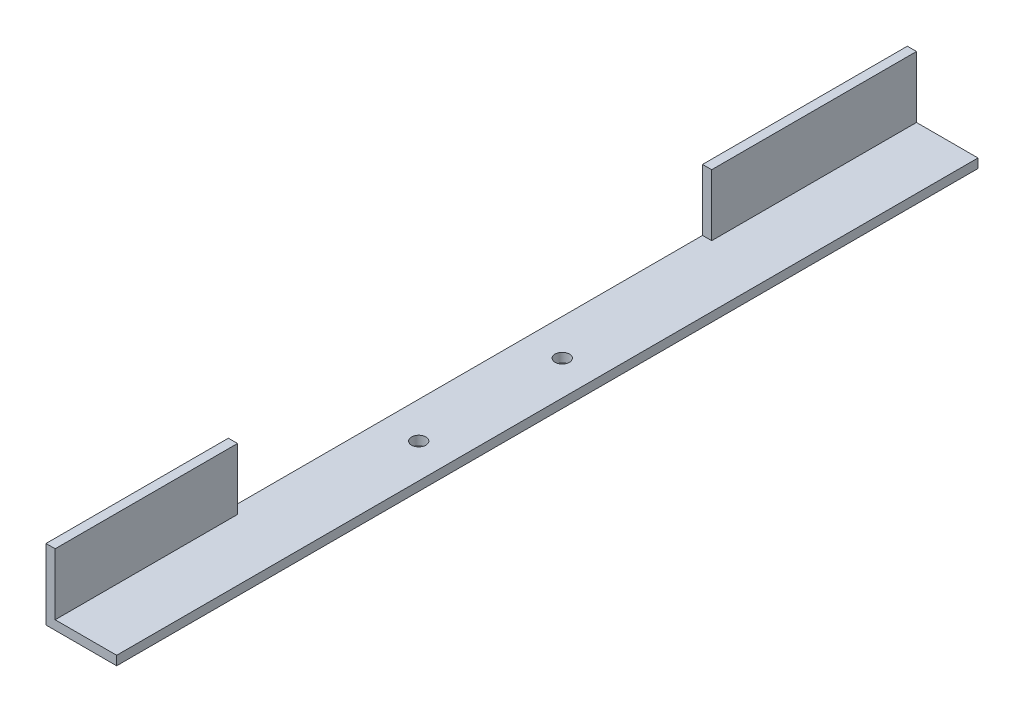
ISO-10303-21;
HEADER;
FILE_DESCRIPTION(('STEP AP214'),'2;1');
FILE_NAME('part.step','',(''),(''),'','','');
FILE_SCHEMA(('AUTOMOTIVE_DESIGN { 1 0 10303 214 1 1 1 1 }'));
ENDSEC;
DATA;
#1=APPLICATION_CONTEXT('core data for automotive mechanical design processes');
#2=APPLICATION_PROTOCOL_DEFINITION('international standard','automotive_design',2000,#1);
#3=PRODUCT_CONTEXT('',#1,'mechanical');
#4=PRODUCT('Part','Part','',(#3));
#5=PRODUCT_RELATED_PRODUCT_CATEGORY('part','',(#4));
#6=PRODUCT_DEFINITION_FORMATION('','',#4);
#7=PRODUCT_DEFINITION_CONTEXT('part definition',#1,'design');
#8=PRODUCT_DEFINITION('design','',#6,#7);
#9=PRODUCT_DEFINITION_SHAPE('','',#8);
#10=(LENGTH_UNIT() NAMED_UNIT(*) SI_UNIT(.MILLI.,.METRE.));
#11=(NAMED_UNIT(*) PLANE_ANGLE_UNIT() SI_UNIT($,.RADIAN.));
#12=(NAMED_UNIT(*) SI_UNIT($,.STERADIAN.) SOLID_ANGLE_UNIT());
#13=UNCERTAINTY_MEASURE_WITH_UNIT(LENGTH_MEASURE(1.E-05),#10,'distance_accuracy_value','');
#14=(GEOMETRIC_REPRESENTATION_CONTEXT(3) GLOBAL_UNCERTAINTY_ASSIGNED_CONTEXT((#13)) GLOBAL_UNIT_ASSIGNED_CONTEXT((#10,
#11,#12)) REPRESENTATION_CONTEXT('',''));
#15=CARTESIAN_POINT('',(0.,0.,0.));
#16=DIRECTION('',(0.,0.,1.));
#17=DIRECTION('',(1.,0.,0.));
#18=AXIS2_PLACEMENT_3D('',#15,#16,#17);
#19=CARTESIAN_POINT('',(3.24,25.,304.8));
#20=DIRECTION('',(-1.,0.,0.));
#21=DIRECTION('',(0.,-1.,0.));
#22=AXIS2_PLACEMENT_3D('',#19,#20,#21);
#23=PLANE('',#22);
#24=DIRECTION('',(0.,0.,-1.));
#25=VECTOR('',#24,1.);
#26=CARTESIAN_POINT('',(3.24,3.24,304.8));
#27=LINE('',#26,#25);
#28=CARTESIAN_POINT('',(3.24,3.24,304.8));
#29=VERTEX_POINT('',#28);
#30=CARTESIAN_POINT('',(3.24,3.24,240.273476344111));
#31=VERTEX_POINT('',#30);
#32=EDGE_CURVE('E154',#29,#31,#27,.T.);
#33=ORIENTED_EDGE('',*,*,#32,.T.);
#34=DIRECTION('',(0.,-1.,0.));
#35=VECTOR('',#34,1.);
#36=CARTESIAN_POINT('',(3.24,3.24,240.273476344111));
#37=LINE('',#36,#35);
#38=CARTESIAN_POINT('',(3.24,25.,240.273476344111));
#39=VERTEX_POINT('',#38);
#40=EDGE_CURVE('E120',#39,#31,#37,.T.);
#41=ORIENTED_EDGE('',*,*,#40,.F.);
#42=DIRECTION('',(0.,0.,-1.));
#43=VECTOR('',#42,1.);
#44=CARTESIAN_POINT('',(3.24,25.,304.8));
#45=LINE('',#44,#43);
#46=CARTESIAN_POINT('',(3.24,25.,304.8));
#47=VERTEX_POINT('',#46);
#48=EDGE_CURVE('E117',#47,#39,#45,.T.);
#49=ORIENTED_EDGE('',*,*,#48,.F.);
#50=DIRECTION('',(0.,1.,0.));
#51=VECTOR('',#50,1.);
#52=CARTESIAN_POINT('',(3.24,25.,304.8));
#53=LINE('',#52,#51);
#54=EDGE_CURVE('E103',#29,#47,#53,.T.);
#55=ORIENTED_EDGE('',*,*,#54,.F.);
#56=EDGE_LOOP('',(#33,#41,#49,#55));
#57=FACE_BOUND('',#56,.T.);
#58=ADVANCED_FACE('F35',(#57),#23,.F.);
#59=CARTESIAN_POINT('',(0.,25.,304.8));
#60=DIRECTION('',(0.,-1.,0.));
#61=DIRECTION('',(0.,0.,-1.));
#62=AXIS2_PLACEMENT_3D('',#59,#60,#61);
#63=PLANE('',#62);
#64=ORIENTED_EDGE('',*,*,#48,.T.);
#65=DIRECTION('',(1.,0.,0.));
#66=VECTOR('',#65,1.);
#67=CARTESIAN_POINT('',(-301.56,24.9999999999999,240.273476344111));
#68=LINE('',#67,#66);
#69=CARTESIAN_POINT('',(-1.11022302462516E-13,25.,240.273476344111));
#70=VERTEX_POINT('',#69);
#71=EDGE_CURVE('E138',#70,#39,#68,.T.);
#72=ORIENTED_EDGE('',*,*,#71,.F.);
#73=DIRECTION('',(0.,0.,-1.));
#74=VECTOR('',#73,1.);
#75=CARTESIAN_POINT('',(0.,25.,304.8));
#76=LINE('',#75,#74);
#77=CARTESIAN_POINT('',(0.,25.,304.8));
#78=VERTEX_POINT('',#77);
#79=EDGE_CURVE('E128',#78,#70,#76,.T.);
#80=ORIENTED_EDGE('',*,*,#79,.F.);
#81=DIRECTION('',(-1.,0.,0.));
#82=VECTOR('',#81,1.);
#83=CARTESIAN_POINT('',(0.,25.,304.8));
#84=LINE('',#83,#82);
#85=EDGE_CURVE('E107',#47,#78,#84,.T.);
#86=ORIENTED_EDGE('',*,*,#85,.F.);
#87=EDGE_LOOP('',(#64,#72,#80,#86));
#88=FACE_BOUND('',#87,.T.);
#89=ADVANCED_FACE('F126',(#88),#63,.F.);
#90=CARTESIAN_POINT('',(0.,0.,304.8));
#91=DIRECTION('',(0.,1.,0.));
#92=DIRECTION('',(0.,0.,1.));
#93=AXIS2_PLACEMENT_3D('',#90,#91,#92);
#94=PLANE('',#93);
#95=CARTESIAN_POINT('',(12.8034461610165,0.,185.715129807359));
#96=DIRECTION('',(0.,1.,0.));
#97=DIRECTION('',(0.,0.,1.));
#98=AXIS2_PLACEMENT_3D('',#95,#96,#97);
#99=CIRCLE('',#98,2.54000000000001);
#100=CARTESIAN_POINT('',(12.8034461610165,-1.11022302462516E-13,188.255129807359));
#101=VERTEX_POINT('',#100);
#102=EDGE_CURVE('E221',#101,#101,#99,.T.);
#103=ORIENTED_EDGE('',*,*,#102,.T.);
#104=EDGE_LOOP('',(#103));
#105=FACE_BOUND('',#104,.T.);
#106=CARTESIAN_POINT('',(12.7974952313434,0.,134.915130155918));
#107=DIRECTION('',(0.,1.,0.));
#108=DIRECTION('',(0.,0.,1.));
#109=AXIS2_PLACEMENT_3D('',#106,#107,#108);
#110=CIRCLE('',#109,2.54000000000001);
#111=CARTESIAN_POINT('',(12.7974952313434,-1.11022302462516E-13,137.455130155918));
#112=VERTEX_POINT('',#111);
#113=EDGE_CURVE('E214',#112,#112,#110,.T.);
#114=ORIENTED_EDGE('',*,*,#113,.T.);
#115=EDGE_LOOP('',(#114));
#116=FACE_BOUND('',#115,.T.);
#117=DIRECTION('',(1.,0.,0.));
#118=VECTOR('',#117,1.);
#119=CARTESIAN_POINT('',(0.,0.,0.));
#120=LINE('',#119,#118);
#121=CARTESIAN_POINT('',(0.,0.,0.));
#122=VERTEX_POINT('',#121);
#123=CARTESIAN_POINT('',(25.,0.,0.));
#124=VERTEX_POINT('',#123);
#125=EDGE_CURVE('E134',#122,#124,#120,.T.);
#126=ORIENTED_EDGE('',*,*,#125,.T.);
#127=DIRECTION('',(0.,0.,-1.));
#128=VECTOR('',#127,1.);
#129=CARTESIAN_POINT('',(25.,0.,304.8));
#130=LINE('',#129,#128);
#131=CARTESIAN_POINT('',(25.,0.,304.8));
#132=VERTEX_POINT('',#131);
#133=EDGE_CURVE('E159',#132,#124,#130,.T.);
#134=ORIENTED_EDGE('',*,*,#133,.F.);
#135=DIRECTION('',(1.,0.,0.));
#136=VECTOR('',#135,1.);
#137=CARTESIAN_POINT('',(0.,0.,304.8));
#138=LINE('',#137,#136);
#139=CARTESIAN_POINT('',(0.,0.,304.8));
#140=VERTEX_POINT('',#139);
#141=EDGE_CURVE('E150',#140,#132,#138,.T.);
#142=ORIENTED_EDGE('',*,*,#141,.F.);
#143=DIRECTION('',(0.,0.,-1.));
#144=VECTOR('',#143,1.);
#145=CARTESIAN_POINT('',(0.,0.,304.8));
#146=LINE('',#145,#144);
#147=EDGE_CURVE('E130',#140,#122,#146,.T.);
#148=ORIENTED_EDGE('',*,*,#147,.T.);
#149=EDGE_LOOP('',(#126,#134,#142,#148));
#150=FACE_BOUND('',#149,.T.);
#151=ADVANCED_FACE('F37',(#105,#116,#150),#94,.F.);
#152=CARTESIAN_POINT('',(25.,0.,304.8));
#153=DIRECTION('',(-1.,0.,0.));
#154=DIRECTION('',(0.,0.,1.));
#155=AXIS2_PLACEMENT_3D('',#152,#153,#154);
#156=PLANE('',#155);
#157=DIRECTION('',(0.,1.,0.));
#158=VECTOR('',#157,1.);
#159=CARTESIAN_POINT('',(25.,0.,0.));
#160=LINE('',#159,#158);
#161=CARTESIAN_POINT('',(25.,3.24,0.));
#162=VERTEX_POINT('',#161);
#163=EDGE_CURVE('E137',#124,#162,#160,.T.);
#164=ORIENTED_EDGE('',*,*,#163,.T.);
#165=DIRECTION('',(0.,0.,-1.));
#166=VECTOR('',#165,1.);
#167=CARTESIAN_POINT('',(25.,3.24,304.8));
#168=LINE('',#167,#166);
#169=CARTESIAN_POINT('',(25.,3.24,304.8));
#170=VERTEX_POINT('',#169);
#171=EDGE_CURVE('E156',#170,#162,#168,.T.);
#172=ORIENTED_EDGE('',*,*,#171,.F.);
#173=DIRECTION('',(0.,1.,0.));
#174=VECTOR('',#173,1.);
#175=CARTESIAN_POINT('',(25.,0.,304.8));
#176=LINE('',#175,#174);
#177=EDGE_CURVE('E94',#132,#170,#176,.T.);
#178=ORIENTED_EDGE('',*,*,#177,.F.);
#179=ORIENTED_EDGE('',*,*,#133,.T.);
#180=EDGE_LOOP('',(#164,#172,#178,#179));
#181=FACE_BOUND('',#180,.T.);
#182=ADVANCED_FACE('F201',(#181),#156,.F.);
#183=CARTESIAN_POINT('',(3.24,3.24,304.8));
#184=DIRECTION('',(0.,-1.,0.));
#185=DIRECTION('',(0.,0.,-1.));
#186=AXIS2_PLACEMENT_3D('',#183,#184,#185);
#187=PLANE('',#186);
#188=CARTESIAN_POINT('',(12.8034461610165,3.24,185.715129807359));
#189=DIRECTION('',(0.,1.,0.));
#190=DIRECTION('',(0.,0.,1.));
#191=AXIS2_PLACEMENT_3D('',#188,#189,#190);
#192=CIRCLE('',#191,2.54000000000001);
#193=CARTESIAN_POINT('',(12.8034461610165,3.24000000000002,188.255129807359));
#194=VERTEX_POINT('',#193);
#195=EDGE_CURVE('E224',#194,#194,#192,.T.);
#196=ORIENTED_EDGE('',*,*,#195,.F.);
#197=EDGE_LOOP('',(#196));
#198=FACE_BOUND('',#197,.T.);
#199=CARTESIAN_POINT('',(12.7974952313434,3.24,134.915130155918));
#200=DIRECTION('',(0.,1.,0.));
#201=DIRECTION('',(0.,0.,1.));
#202=AXIS2_PLACEMENT_3D('',#199,#200,#201);
#203=CIRCLE('',#202,2.54000000000001);
#204=CARTESIAN_POINT('',(12.7974952313434,3.24000000000002,137.455130155918));
#205=VERTEX_POINT('',#204);
#206=EDGE_CURVE('E216',#205,#205,#203,.T.);
#207=ORIENTED_EDGE('',*,*,#206,.F.);
#208=EDGE_LOOP('',(#207));
#209=FACE_BOUND('',#208,.T.);
#210=DIRECTION('',(-1.,0.,0.));
#211=VECTOR('',#210,1.);
#212=CARTESIAN_POINT('',(3.24,3.24,0.));
#213=LINE('',#212,#211);
#214=CARTESIAN_POINT('',(3.24,3.24,0.));
#215=VERTEX_POINT('',#214);
#216=EDGE_CURVE('E140',#162,#215,#213,.T.);
#217=ORIENTED_EDGE('',*,*,#216,.T.);
#218=CARTESIAN_POINT('',(3.24,3.24,72.471684265664));
#219=VERTEX_POINT('',#218);
#220=EDGE_CURVE('E123',#219,#215,#27,.T.);
#221=ORIENTED_EDGE('',*,*,#220,.F.);
#222=DIRECTION('',(1.,0.,0.));
#223=VECTOR('',#222,1.);
#224=CARTESIAN_POINT('',(-301.56,3.23999999999995,72.471684265664));
#225=LINE('',#224,#223);
#226=CARTESIAN_POINT('',(0.,3.24,72.471684265664));
#227=VERTEX_POINT('',#226);
#228=EDGE_CURVE('E50',#227,#219,#225,.T.);
#229=ORIENTED_EDGE('',*,*,#228,.F.);
#230=DIRECTION('',(0.,0.,-1.));
#231=VECTOR('',#230,1.);
#232=CARTESIAN_POINT('',(0.,3.24,304.8));
#233=LINE('',#232,#231);
#234=CARTESIAN_POINT('',(-1.11022302462516E-13,3.24,240.273476344111));
#235=VERTEX_POINT('',#234);
#236=EDGE_CURVE('E161',#235,#227,#233,.T.);
#237=ORIENTED_EDGE('',*,*,#236,.F.);
#238=DIRECTION('',(1.,0.,0.));
#239=VECTOR('',#238,1.);
#240=CARTESIAN_POINT('',(-301.56,3.23999999999995,240.273476344111));
#241=LINE('',#240,#239);
#242=EDGE_CURVE('E191',#235,#31,#241,.T.);
#243=ORIENTED_EDGE('',*,*,#242,.T.);
#244=ORIENTED_EDGE('',*,*,#32,.F.);
#245=DIRECTION('',(-1.,0.,0.));
#246=VECTOR('',#245,1.);
#247=CARTESIAN_POINT('',(3.24,3.24,304.8));
#248=LINE('',#247,#246);
#249=EDGE_CURVE('E110',#170,#29,#248,.T.);
#250=ORIENTED_EDGE('',*,*,#249,.F.);
#251=ORIENTED_EDGE('',*,*,#171,.T.);
#252=EDGE_LOOP('',(#217,#221,#229,#237,#243,#244,#250,#251));
#253=FACE_BOUND('',#252,.T.);
#254=ADVANCED_FACE('F202',(#198,#209,#253),#187,.F.);
#255=CARTESIAN_POINT('',(3.24,25.,72.471684265664));
#256=VERTEX_POINT('',#255);
#257=CARTESIAN_POINT('',(3.24,25.,0.));
#258=VERTEX_POINT('',#257);
#259=EDGE_CURVE('E124',#256,#258,#45,.T.);
#260=ORIENTED_EDGE('',*,*,#259,.F.);
#261=DIRECTION('',(0.,1.,0.));
#262=VECTOR('',#261,1.);
#263=CARTESIAN_POINT('',(3.24,3.24,72.471684265664));
#264=LINE('',#263,#262);
#265=EDGE_CURVE('E195',#219,#256,#264,.T.);
#266=ORIENTED_EDGE('',*,*,#265,.F.);
#267=ORIENTED_EDGE('',*,*,#220,.T.);
#268=DIRECTION('',(0.,1.,0.));
#269=VECTOR('',#268,1.);
#270=CARTESIAN_POINT('',(3.24,25.,0.));
#271=LINE('',#270,#269);
#272=EDGE_CURVE('E143',#215,#258,#271,.T.);
#273=ORIENTED_EDGE('',*,*,#272,.T.);
#274=EDGE_LOOP('',(#260,#266,#267,#273));
#275=FACE_BOUND('',#274,.T.);
#276=ADVANCED_FACE('F233',(#275),#23,.F.);
#277=CARTESIAN_POINT('',(-1.11022302462516E-13,25.,72.471684265664));
#278=VERTEX_POINT('',#277);
#279=CARTESIAN_POINT('',(0.,25.,0.));
#280=VERTEX_POINT('',#279);
#281=EDGE_CURVE('E152',#278,#280,#76,.T.);
#282=ORIENTED_EDGE('',*,*,#281,.F.);
#283=DIRECTION('',(1.,0.,0.));
#284=VECTOR('',#283,1.);
#285=CARTESIAN_POINT('',(-301.56,24.9999999999999,72.471684265664));
#286=LINE('',#285,#284);
#287=EDGE_CURVE('E174',#278,#256,#286,.T.);
#288=ORIENTED_EDGE('',*,*,#287,.T.);
#289=ORIENTED_EDGE('',*,*,#259,.T.);
#290=DIRECTION('',(-1.,0.,0.));
#291=VECTOR('',#290,1.);
#292=CARTESIAN_POINT('',(0.,25.,0.));
#293=LINE('',#292,#291);
#294=EDGE_CURVE('E146',#258,#280,#293,.T.);
#295=ORIENTED_EDGE('',*,*,#294,.T.);
#296=EDGE_LOOP('',(#282,#288,#289,#295));
#297=FACE_BOUND('',#296,.T.);
#298=ADVANCED_FACE('F172',(#297),#63,.F.);
#299=CARTESIAN_POINT('',(0.,0.,304.8));
#300=DIRECTION('',(1.,0.,0.));
#301=DIRECTION('',(0.,0.,-1.));
#302=AXIS2_PLACEMENT_3D('',#299,#300,#301);
#303=PLANE('',#302);
#304=ORIENTED_EDGE('',*,*,#79,.T.);
#305=DIRECTION('',(0.,-1.,0.));
#306=VECTOR('',#305,1.);
#307=CARTESIAN_POINT('',(0.,0.,240.273476344111));
#308=LINE('',#307,#306);
#309=EDGE_CURVE('E11',#70,#235,#308,.T.);
#310=ORIENTED_EDGE('',*,*,#309,.T.);
#311=ORIENTED_EDGE('',*,*,#236,.T.);
#312=DIRECTION('',(0.,1.,0.));
#313=VECTOR('',#312,1.);
#314=CARTESIAN_POINT('',(0.,0.,72.471684265664));
#315=LINE('',#314,#313);
#316=EDGE_CURVE('E43',#227,#278,#315,.T.);
#317=ORIENTED_EDGE('',*,*,#316,.T.);
#318=ORIENTED_EDGE('',*,*,#281,.T.);
#319=DIRECTION('',(0.,-1.,0.));
#320=VECTOR('',#319,1.);
#321=CARTESIAN_POINT('',(0.,0.,0.));
#322=LINE('',#321,#320);
#323=EDGE_CURVE('E85',#280,#122,#322,.T.);
#324=ORIENTED_EDGE('',*,*,#323,.T.);
#325=ORIENTED_EDGE('',*,*,#147,.F.);
#326=DIRECTION('',(0.,-1.,0.));
#327=VECTOR('',#326,1.);
#328=CARTESIAN_POINT('',(0.,0.,304.8));
#329=LINE('',#328,#327);
#330=EDGE_CURVE('E59',#78,#140,#329,.T.);
#331=ORIENTED_EDGE('',*,*,#330,.F.);
#332=EDGE_LOOP('',(#304,#310,#311,#317,#318,#324,#325,#331));
#333=FACE_BOUND('',#332,.T.);
#334=ADVANCED_FACE('F166',(#333),#303,.F.);
#335=CARTESIAN_POINT('',(0.,0.,304.8));
#336=DIRECTION('',(0.,0.,1.));
#337=DIRECTION('',(1.,0.,0.));
#338=AXIS2_PLACEMENT_3D('',#335,#336,#337);
#339=PLANE('',#338);
#340=ORIENTED_EDGE('',*,*,#141,.T.);
#341=ORIENTED_EDGE('',*,*,#177,.T.);
#342=ORIENTED_EDGE('',*,*,#249,.T.);
#343=ORIENTED_EDGE('',*,*,#54,.T.);
#344=ORIENTED_EDGE('',*,*,#85,.T.);
#345=ORIENTED_EDGE('',*,*,#330,.T.);
#346=EDGE_LOOP('',(#340,#341,#342,#343,#344,#345));
#347=FACE_BOUND('',#346,.T.);
#348=ADVANCED_FACE('F105',(#347),#339,.T.);
#349=CARTESIAN_POINT('',(0.,0.,0.));
#350=DIRECTION('',(0.,0.,1.));
#351=DIRECTION('',(1.,0.,0.));
#352=AXIS2_PLACEMENT_3D('',#349,#350,#351);
#353=PLANE('',#352);
#354=ORIENTED_EDGE('',*,*,#125,.F.);
#355=ORIENTED_EDGE('',*,*,#323,.F.);
#356=ORIENTED_EDGE('',*,*,#294,.F.);
#357=ORIENTED_EDGE('',*,*,#272,.F.);
#358=ORIENTED_EDGE('',*,*,#216,.F.);
#359=ORIENTED_EDGE('',*,*,#163,.F.);
#360=EDGE_LOOP('',(#354,#355,#356,#357,#358,#359));
#361=FACE_BOUND('',#360,.T.);
#362=ADVANCED_FACE('F180',(#361),#353,.F.);
#363=CARTESIAN_POINT('',(-301.56,3.23999999999995,240.273476344111));
#364=DIRECTION('',(0.,0.,1.));
#365=DIRECTION('',(1.,0.,0.));
#366=AXIS2_PLACEMENT_3D('',#363,#364,#365);
#367=PLANE('',#366);
#368=ORIENTED_EDGE('',*,*,#71,.T.);
#369=ORIENTED_EDGE('',*,*,#40,.T.);
#370=ORIENTED_EDGE('',*,*,#242,.F.);
#371=ORIENTED_EDGE('',*,*,#309,.F.);
#372=EDGE_LOOP('',(#368,#369,#370,#371));
#373=FACE_BOUND('',#372,.T.);
#374=ADVANCED_FACE('F189',(#373),#367,.F.);
#375=CARTESIAN_POINT('',(-301.56,3.23999999999995,72.471684265664));
#376=DIRECTION('',(0.,0.,-1.));
#377=DIRECTION('',(-1.,0.,0.));
#378=AXIS2_PLACEMENT_3D('',#375,#376,#377);
#379=PLANE('',#378);
#380=ORIENTED_EDGE('',*,*,#228,.T.);
#381=ORIENTED_EDGE('',*,*,#265,.T.);
#382=ORIENTED_EDGE('',*,*,#287,.F.);
#383=ORIENTED_EDGE('',*,*,#316,.F.);
#384=EDGE_LOOP('',(#380,#381,#382,#383));
#385=FACE_BOUND('',#384,.T.);
#386=ADVANCED_FACE('F212',(#385),#379,.F.);
#387=CARTESIAN_POINT('',(12.7974952313434,-301.56,134.915130155918));
#388=DIRECTION('',(0.,1.,0.));
#389=DIRECTION('',(0.,0.,1.));
#390=AXIS2_PLACEMENT_3D('',#387,#388,#389);
#391=CYLINDRICAL_SURFACE('',#390,2.54000000000001);
#392=CARTESIAN_POINT('',(12.7974952313434,3.24000000000002,137.455130155918));
#393=CARTESIAN_POINT('',(12.7974952313434,3.20625000000002,137.455130155918));
#394=CARTESIAN_POINT('',(12.7974952313434,3.17250000000002,137.455130155918));
#395=CARTESIAN_POINT('',(12.7974952313434,3.10500000000002,137.455130155918));
#396=CARTESIAN_POINT('',(12.7974952313434,3.07125000000003,137.455130155918));
#397=CARTESIAN_POINT('',(12.7974952313434,3.00375000000003,137.455130155918));
#398=CARTESIAN_POINT('',(12.7974952313434,2.97000000000003,137.455130155918));
#399=CARTESIAN_POINT('',(12.7974952313434,2.90250000000003,137.455130155918));
#400=CARTESIAN_POINT('',(12.7974952313434,2.86875000000003,137.455130155918));
#401=CARTESIAN_POINT('',(12.7974952313434,2.80125000000001,137.455130155918));
#402=CARTESIAN_POINT('',(12.7974952313434,2.7675,137.455130155918));
#403=CARTESIAN_POINT('',(12.7974952313434,2.69999999999998,137.455130155918));
#404=CARTESIAN_POINT('',(12.7974952313434,2.66624999999998,137.455130155918));
#405=CARTESIAN_POINT('',(12.7974952313434,2.59874999999998,137.455130155918));
#406=CARTESIAN_POINT('',(12.7974952313434,2.56499999999998,137.455130155918));
#407=CARTESIAN_POINT('',(12.7974952313434,2.49749999999999,137.455130155918));
#408=CARTESIAN_POINT('',(12.7974952313434,2.46374999999999,137.455130155918));
#409=CARTESIAN_POINT('',(12.7974952313434,2.39624999999999,137.455130155918));
#410=CARTESIAN_POINT('',(12.7974952313434,2.36249999999999,137.455130155918));
#411=CARTESIAN_POINT('',(12.7974952313434,2.29499999999999,137.455130155918));
#412=CARTESIAN_POINT('',(12.7974952313434,2.26124999999999,137.455130155918));
#413=CARTESIAN_POINT('',(12.7974952313434,2.19374999999999,137.455130155918));
#414=CARTESIAN_POINT('',(12.7974952313434,2.16,137.455130155918));
#415=CARTESIAN_POINT('',(12.7974952313434,2.09249999999998,137.455130155918));
#416=CARTESIAN_POINT('',(12.7974952313434,2.05874999999996,137.455130155918));
#417=CARTESIAN_POINT('',(12.7974952313434,1.99124999999994,137.455130155918));
#418=CARTESIAN_POINT('',(12.7974952313434,1.95749999999995,137.455130155918));
#419=CARTESIAN_POINT('',(12.7974952313434,1.88999999999995,137.455130155918));
#420=CARTESIAN_POINT('',(12.7974952313434,1.85624999999995,137.455130155918));
#421=CARTESIAN_POINT('',(12.7974952313434,1.78874999999995,137.455130155918));
#422=CARTESIAN_POINT('',(12.7974952313434,1.75499999999995,137.455130155918));
#423=CARTESIAN_POINT('',(12.7974952313434,1.68749999999995,137.455130155918));
#424=CARTESIAN_POINT('',(12.7974952313434,1.65374999999995,137.455130155918));
#425=CARTESIAN_POINT('',(12.7974952313434,1.58624999999996,137.455130155918));
#426=CARTESIAN_POINT('',(12.7974952313434,1.55249999999996,137.455130155918));
#427=CARTESIAN_POINT('',(12.7974952313434,1.48499999999996,137.455130155918));
#428=CARTESIAN_POINT('',(12.7974952313434,1.45124999999996,137.455130155918));
#429=CARTESIAN_POINT('',(12.7974952313434,1.38374999999996,137.455130155918));
#430=CARTESIAN_POINT('',(12.7974952313434,1.34999999999996,137.455130155918));
#431=CARTESIAN_POINT('',(12.7974952313434,1.28249999999996,137.455130155918));
#432=CARTESIAN_POINT('',(12.7974952313434,1.24874999999997,137.455130155918));
#433=CARTESIAN_POINT('',(12.7974952313434,1.18124999999995,137.455130155918));
#434=CARTESIAN_POINT('',(12.7974952313434,1.14749999999993,137.455130155918));
#435=CARTESIAN_POINT('',(12.7974952313434,1.07999999999991,137.455130155918));
#436=CARTESIAN_POINT('',(12.7974952313434,1.04624999999992,137.455130155918));
#437=CARTESIAN_POINT('',(12.7974952313434,0.978749999999917,137.455130155918));
#438=CARTESIAN_POINT('',(12.7974952313434,0.944999999999918,137.455130155918));
#439=CARTESIAN_POINT('',(12.7974952313434,0.87749999999992,137.455130155918));
#440=CARTESIAN_POINT('',(12.7974952313434,0.843749999999921,137.455130155918));
#441=CARTESIAN_POINT('',(12.7974952313434,0.776249999999923,137.455130155918));
#442=CARTESIAN_POINT('',(12.7974952313434,0.742499999999924,137.455130155918));
#443=CARTESIAN_POINT('',(12.7974952313434,0.674999999999926,137.455130155918));
#444=CARTESIAN_POINT('',(12.7974952313434,0.641249999999927,137.455130155918));
#445=CARTESIAN_POINT('',(12.7974952313434,0.573749999999928,137.455130155918));
#446=CARTESIAN_POINT('',(12.7974952313434,0.539999999999929,137.455130155918));
#447=CARTESIAN_POINT('',(12.7974952313434,0.472499999999913,137.455130155918));
#448=CARTESIAN_POINT('',(12.7974952313434,0.438749999999895,137.455130155918));
#449=CARTESIAN_POINT('',(12.7974952313434,0.371249999999879,137.455130155918));
#450=CARTESIAN_POINT('',(12.7974952313434,0.33749999999988,137.455130155918));
#451=CARTESIAN_POINT('',(12.7974952313434,0.269999999999881,137.455130155918));
#452=CARTESIAN_POINT('',(12.7974952313434,0.236249999999882,137.455130155918));
#453=CARTESIAN_POINT('',(12.7974952313434,0.168749999999884,137.455130155918));
#454=CARTESIAN_POINT('',(12.7974952313434,0.134999999999885,137.455130155918));
#455=CARTESIAN_POINT('',(12.7974952313434,0.0674999999998871,137.455130155918));
#456=CARTESIAN_POINT('',(12.7974952313434,0.033749999999888,137.455130155918));
#457=CARTESIAN_POINT('',(12.7974952313434,-1.11022302462516E-13,137.455130155918));
#458=B_SPLINE_CURVE_WITH_KNOTS('',3,(#392,#393,#394,#395,#396,#397,#398,#399,#400,#401,#402,
#403,#404,#405,#406,#407,#408,#409,#410,#411,#412,#413,#414,#415,#416,#417,#418,#419,#420,#421,
#422,#423,#424,#425,#426,#427,#428,#429,#430,#431,#432,#433,#434,#435,#436,#437,#438,#439,#440,
#441,#442,#443,#444,#445,#446,#447,#448,#449,#450,#451,#452,#453,#454,#455,#456,#457),
.UNSPECIFIED.,.F.,.F.,(4,2,2,2,2,2,2,2,2,2,2,2,2,2,2,2,2,2,2,2,2,2,2,2,2,2,2,2,2,2,2,2,4),(0.,
0.101249999999997,0.202499999999994,0.303749999999992,0.404999999999989,0.506250000000041,
0.607500000000039,0.708750000000036,0.810000000000033,0.91125000000003,1.01250000000003,
1.11375000000002,1.21500000000008,1.31625000000007,1.41750000000007,1.51875000000007,
1.62000000000007,1.72125000000006,1.82250000000006,1.92375000000006,2.02500000000005,
2.12625000000011,2.2275000000001,2.3287500000001,2.4300000000001,2.5312500000001,
2.63250000000009,2.73375000000009,2.83500000000014,2.93625000000014,3.03750000000014,
3.13875000000013,3.24000000000013),.UNSPECIFIED.);
#459=EDGE_CURVE('BSEAM237',#205,#112,#458,.T.);
#460=ORIENTED_EDGE('',*,*,#206,.T.);
#461=ORIENTED_EDGE('',*,*,#113,.F.);
#462=ORIENTED_EDGE('',*,*,#459,.T.);
#463=ORIENTED_EDGE('',*,*,#459,.F.);
#464=EDGE_LOOP('',(#460,#462,#461,#463));
#465=FACE_BOUND('',#464,.T.);
#466=ADVANCED_FACE('F237',(#465),#391,.F.);
#467=CARTESIAN_POINT('',(12.8034461610165,-301.56,185.715129807359));
#468=DIRECTION('',(0.,1.,0.));
#469=DIRECTION('',(0.,0.,1.));
#470=AXIS2_PLACEMENT_3D('',#467,#468,#469);
#471=CYLINDRICAL_SURFACE('',#470,2.54000000000001);
#472=CARTESIAN_POINT('',(12.8034461610165,3.24000000000002,188.255129807359));
#473=CARTESIAN_POINT('',(12.8034461610165,3.20625000000002,188.255129807359));
#474=CARTESIAN_POINT('',(12.8034461610165,3.17250000000002,188.255129807359));
#475=CARTESIAN_POINT('',(12.8034461610165,3.10500000000002,188.255129807359));
#476=CARTESIAN_POINT('',(12.8034461610165,3.07125000000003,188.255129807359));
#477=CARTESIAN_POINT('',(12.8034461610165,3.00375000000003,188.255129807359));
#478=CARTESIAN_POINT('',(12.8034461610165,2.97000000000003,188.255129807359));
#479=CARTESIAN_POINT('',(12.8034461610165,2.90250000000003,188.255129807359));
#480=CARTESIAN_POINT('',(12.8034461610165,2.86875000000003,188.255129807359));
#481=CARTESIAN_POINT('',(12.8034461610165,2.80125000000001,188.255129807359));
#482=CARTESIAN_POINT('',(12.8034461610165,2.7675,188.255129807359));
#483=CARTESIAN_POINT('',(12.8034461610165,2.69999999999998,188.255129807359));
#484=CARTESIAN_POINT('',(12.8034461610165,2.66624999999998,188.255129807359));
#485=CARTESIAN_POINT('',(12.8034461610165,2.59874999999998,188.255129807359));
#486=CARTESIAN_POINT('',(12.8034461610165,2.56499999999998,188.255129807359));
#487=CARTESIAN_POINT('',(12.8034461610165,2.49749999999999,188.255129807359));
#488=CARTESIAN_POINT('',(12.8034461610165,2.46374999999999,188.255129807359));
#489=CARTESIAN_POINT('',(12.8034461610165,2.39624999999999,188.255129807359));
#490=CARTESIAN_POINT('',(12.8034461610165,2.36249999999999,188.255129807359));
#491=CARTESIAN_POINT('',(12.8034461610165,2.29499999999999,188.255129807359));
#492=CARTESIAN_POINT('',(12.8034461610165,2.26124999999999,188.255129807359));
#493=CARTESIAN_POINT('',(12.8034461610165,2.19374999999999,188.255129807359));
#494=CARTESIAN_POINT('',(12.8034461610165,2.16,188.255129807359));
#495=CARTESIAN_POINT('',(12.8034461610165,2.09249999999998,188.255129807359));
#496=CARTESIAN_POINT('',(12.8034461610165,2.05874999999996,188.255129807359));
#497=CARTESIAN_POINT('',(12.8034461610165,1.99124999999994,188.255129807359));
#498=CARTESIAN_POINT('',(12.8034461610165,1.95749999999995,188.255129807359));
#499=CARTESIAN_POINT('',(12.8034461610165,1.88999999999995,188.255129807359));
#500=CARTESIAN_POINT('',(12.8034461610165,1.85624999999995,188.255129807359));
#501=CARTESIAN_POINT('',(12.8034461610165,1.78874999999995,188.255129807359));
#502=CARTESIAN_POINT('',(12.8034461610165,1.75499999999995,188.255129807359));
#503=CARTESIAN_POINT('',(12.8034461610165,1.68749999999995,188.255129807359));
#504=CARTESIAN_POINT('',(12.8034461610165,1.65374999999995,188.255129807359));
#505=CARTESIAN_POINT('',(12.8034461610165,1.58624999999996,188.255129807359));
#506=CARTESIAN_POINT('',(12.8034461610165,1.55249999999996,188.255129807359));
#507=CARTESIAN_POINT('',(12.8034461610165,1.48499999999996,188.255129807359));
#508=CARTESIAN_POINT('',(12.8034461610165,1.45124999999996,188.255129807359));
#509=CARTESIAN_POINT('',(12.8034461610165,1.38374999999996,188.255129807359));
#510=CARTESIAN_POINT('',(12.8034461610165,1.34999999999996,188.255129807359));
#511=CARTESIAN_POINT('',(12.8034461610165,1.28249999999996,188.255129807359));
#512=CARTESIAN_POINT('',(12.8034461610165,1.24874999999997,188.255129807359));
#513=CARTESIAN_POINT('',(12.8034461610165,1.18124999999995,188.255129807359));
#514=CARTESIAN_POINT('',(12.8034461610165,1.14749999999993,188.255129807359));
#515=CARTESIAN_POINT('',(12.8034461610165,1.07999999999991,188.255129807359));
#516=CARTESIAN_POINT('',(12.8034461610165,1.04624999999992,188.255129807359));
#517=CARTESIAN_POINT('',(12.8034461610165,0.978749999999917,188.255129807359));
#518=CARTESIAN_POINT('',(12.8034461610165,0.944999999999918,188.255129807359));
#519=CARTESIAN_POINT('',(12.8034461610165,0.87749999999992,188.255129807359));
#520=CARTESIAN_POINT('',(12.8034461610165,0.843749999999921,188.255129807359));
#521=CARTESIAN_POINT('',(12.8034461610165,0.776249999999923,188.255129807359));
#522=CARTESIAN_POINT('',(12.8034461610165,0.742499999999924,188.255129807359));
#523=CARTESIAN_POINT('',(12.8034461610165,0.674999999999926,188.255129807359));
#524=CARTESIAN_POINT('',(12.8034461610165,0.641249999999927,188.255129807359));
#525=CARTESIAN_POINT('',(12.8034461610165,0.573749999999928,188.255129807359));
#526=CARTESIAN_POINT('',(12.8034461610165,0.539999999999929,188.255129807359));
#527=CARTESIAN_POINT('',(12.8034461610165,0.472499999999913,188.255129807359));
#528=CARTESIAN_POINT('',(12.8034461610165,0.438749999999895,188.255129807359));
#529=CARTESIAN_POINT('',(12.8034461610165,0.371249999999879,188.255129807359));
#530=CARTESIAN_POINT('',(12.8034461610165,0.33749999999988,188.255129807359));
#531=CARTESIAN_POINT('',(12.8034461610165,0.269999999999881,188.255129807359));
#532=CARTESIAN_POINT('',(12.8034461610165,0.236249999999882,188.255129807359));
#533=CARTESIAN_POINT('',(12.8034461610165,0.168749999999884,188.255129807359));
#534=CARTESIAN_POINT('',(12.8034461610165,0.134999999999885,188.255129807359));
#535=CARTESIAN_POINT('',(12.8034461610165,0.0674999999998871,188.255129807359));
#536=CARTESIAN_POINT('',(12.8034461610165,0.033749999999888,188.255129807359));
#537=CARTESIAN_POINT('',(12.8034461610165,-1.11022302462516E-13,188.255129807359));
#538=B_SPLINE_CURVE_WITH_KNOTS('',3,(#472,#473,#474,#475,#476,#477,#478,#479,#480,#481,#482,
#483,#484,#485,#486,#487,#488,#489,#490,#491,#492,#493,#494,#495,#496,#497,#498,#499,#500,#501,
#502,#503,#504,#505,#506,#507,#508,#509,#510,#511,#512,#513,#514,#515,#516,#517,#518,#519,#520,
#521,#522,#523,#524,#525,#526,#527,#528,#529,#530,#531,#532,#533,#534,#535,#536,#537),
.UNSPECIFIED.,.F.,.F.,(4,2,2,2,2,2,2,2,2,2,2,2,2,2,2,2,2,2,2,2,2,2,2,2,2,2,2,2,2,2,2,2,4),(0.,
0.101249999999997,0.202499999999994,0.303749999999992,0.404999999999989,0.506250000000041,
0.607500000000039,0.708750000000036,0.810000000000033,0.91125000000003,1.01250000000003,
1.11375000000002,1.21500000000008,1.31625000000007,1.41750000000007,1.51875000000007,
1.62000000000007,1.72125000000006,1.82250000000006,1.92375000000006,2.02500000000005,
2.12625000000011,2.2275000000001,2.3287500000001,2.4300000000001,2.5312500000001,
2.63250000000009,2.73375000000009,2.83500000000014,2.93625000000014,3.03750000000014,
3.13875000000013,3.24000000000013),.UNSPECIFIED.);
#539=EDGE_CURVE('BSEAM228',#194,#101,#538,.T.);
#540=ORIENTED_EDGE('',*,*,#195,.T.);
#541=ORIENTED_EDGE('',*,*,#102,.F.);
#542=ORIENTED_EDGE('',*,*,#539,.T.);
#543=ORIENTED_EDGE('',*,*,#539,.F.);
#544=EDGE_LOOP('',(#540,#542,#541,#543));
#545=FACE_BOUND('',#544,.T.);
#546=ADVANCED_FACE('F228',(#545),#471,.F.);
#547=CLOSED_SHELL('',(#58,#89,#151,#182,#254,#276,#298,#334,#348,#362,#374,#386,#466,#546));
#548=MANIFOLD_SOLID_BREP('B2',#547);
#549=ADVANCED_BREP_SHAPE_REPRESENTATION('',(#18,#548),#14);
#550=SHAPE_DEFINITION_REPRESENTATION(#9,#549);
ENDSEC;
END-ISO-10303-21;
